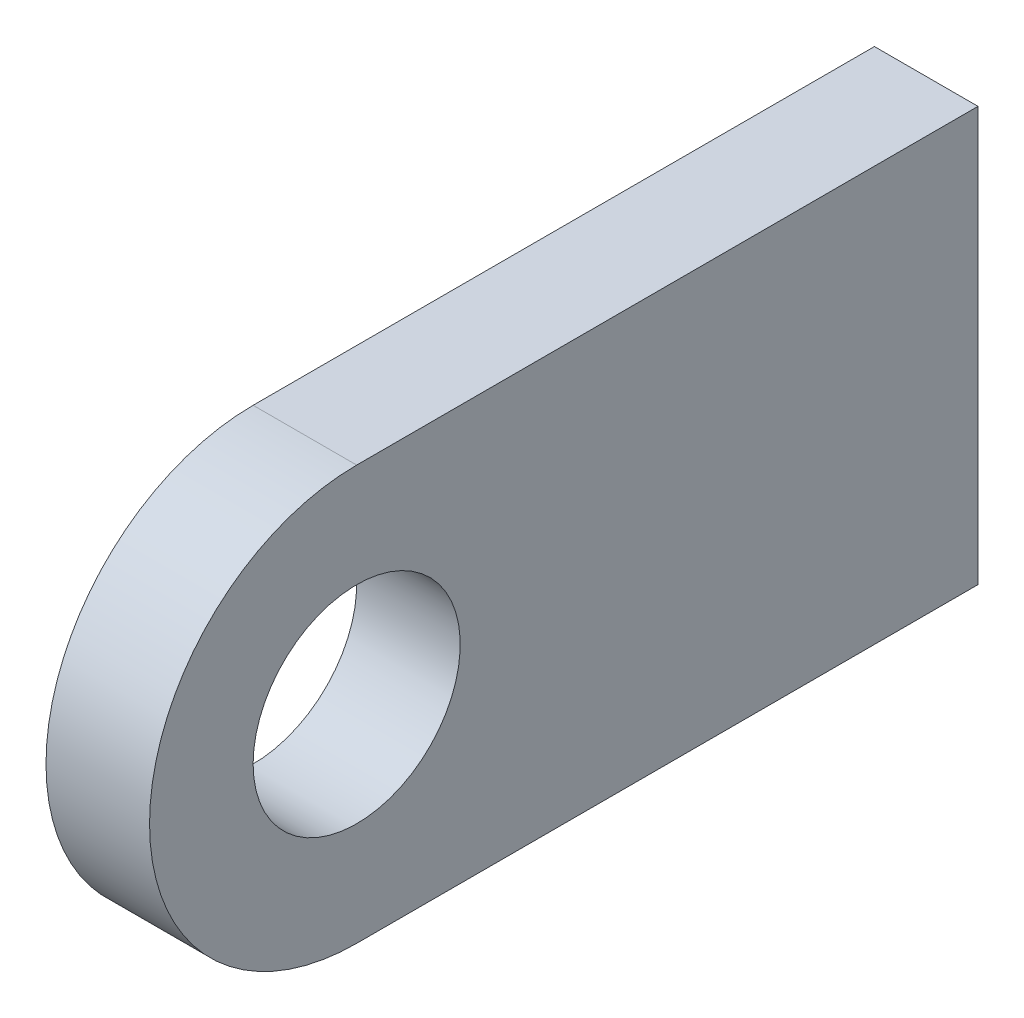
ISO-10303-21;
HEADER;
FILE_DESCRIPTION(('STEP AP214'),'2;1');
FILE_NAME('part.step','',(''),(''),'','','');
FILE_SCHEMA(('AUTOMOTIVE_DESIGN { 1 0 10303 214 1 1 1 1 }'));
ENDSEC;
DATA;
#1=APPLICATION_CONTEXT('core data for automotive mechanical design processes');
#2=APPLICATION_PROTOCOL_DEFINITION('international standard','automotive_design',2000,#1);
#3=PRODUCT_CONTEXT('',#1,'mechanical');
#4=PRODUCT('Part','Part','',(#3));
#5=PRODUCT_RELATED_PRODUCT_CATEGORY('part','',(#4));
#6=PRODUCT_DEFINITION_FORMATION('','',#4);
#7=PRODUCT_DEFINITION_CONTEXT('part definition',#1,'design');
#8=PRODUCT_DEFINITION('design','',#6,#7);
#9=PRODUCT_DEFINITION_SHAPE('','',#8);
#10=(LENGTH_UNIT() NAMED_UNIT(*) SI_UNIT(.MILLI.,.METRE.));
#11=(NAMED_UNIT(*) PLANE_ANGLE_UNIT() SI_UNIT($,.RADIAN.));
#12=(NAMED_UNIT(*) SI_UNIT($,.STERADIAN.) SOLID_ANGLE_UNIT());
#13=UNCERTAINTY_MEASURE_WITH_UNIT(LENGTH_MEASURE(1.E-05),#10,'distance_accuracy_value','');
#14=(GEOMETRIC_REPRESENTATION_CONTEXT(3) GLOBAL_UNCERTAINTY_ASSIGNED_CONTEXT((#13)) GLOBAL_UNIT_ASSIGNED_CONTEXT((#10,
#11,#12)) REPRESENTATION_CONTEXT('',''));
#15=CARTESIAN_POINT('',(0.,0.,0.));
#16=DIRECTION('',(0.,0.,1.));
#17=DIRECTION('',(1.,0.,0.));
#18=AXIS2_PLACEMENT_3D('',#15,#16,#17);
#19=CARTESIAN_POINT('',(-13.,-200.,150.));
#20=DIRECTION('',(-1.,0.,0.));
#21=DIRECTION('',(0.,0.,1.));
#22=AXIS2_PLACEMENT_3D('',#19,#20,#21);
#23=PLANE('',#22);
#24=CARTESIAN_POINT('',(-13.,-200.,150.));
#25=DIRECTION('',(-1.,0.,0.));
#26=DIRECTION('',(0.,0.,1.));
#27=AXIS2_PLACEMENT_3D('',#24,#25,#26);
#28=CIRCLE('',#27,10.);
#29=CARTESIAN_POINT('',(-13.,-210.,150.));
#30=VERTEX_POINT('',#29);
#31=CARTESIAN_POINT('',(-13.,-190.,150.));
#32=VERTEX_POINT('',#31);
#33=EDGE_CURVE('E111',#30,#32,#28,.T.);
#34=ORIENTED_EDGE('',*,*,#33,.T.);
#35=DIRECTION('',(0.,0.,-1.));
#36=VECTOR('',#35,1.);
#37=CARTESIAN_POINT('',(-13.,-190.,150.));
#38=LINE('',#37,#36);
#39=CARTESIAN_POINT('',(-13.,-190.,120.));
#40=VERTEX_POINT('',#39);
#41=EDGE_CURVE('E109',#32,#40,#38,.T.);
#42=ORIENTED_EDGE('',*,*,#41,.T.);
#43=DIRECTION('',(0.,-1.,0.));
#44=VECTOR('',#43,1.);
#45=CARTESIAN_POINT('',(-13.,-190.,120.));
#46=LINE('',#45,#44);
#47=CARTESIAN_POINT('',(-13.,-210.,120.));
#48=VERTEX_POINT('',#47);
#49=EDGE_CURVE('E107',#40,#48,#46,.T.);
#50=ORIENTED_EDGE('',*,*,#49,.T.);
#51=DIRECTION('',(0.,0.,1.));
#52=VECTOR('',#51,1.);
#53=CARTESIAN_POINT('',(-13.,-210.,120.));
#54=LINE('',#53,#52);
#55=EDGE_CURVE('E66',#48,#30,#54,.T.);
#56=ORIENTED_EDGE('',*,*,#55,.T.);
#57=EDGE_LOOP('',(#34,#42,#50,#56));
#58=FACE_BOUND('',#57,.T.);
#59=CARTESIAN_POINT('',(-13.,-200.,150.));
#60=DIRECTION('',(-1.,0.,0.));
#61=DIRECTION('',(0.,0.,1.));
#62=AXIS2_PLACEMENT_3D('',#59,#60,#61);
#63=CIRCLE('',#62,4.99999999999999);
#64=CARTESIAN_POINT('',(-13.,-200.,155.));
#65=VERTEX_POINT('',#64);
#66=EDGE_CURVE('E113',#65,#65,#63,.T.);
#67=ORIENTED_EDGE('',*,*,#66,.F.);
#68=EDGE_LOOP('',(#67));
#69=FACE_BOUND('',#68,.T.);
#70=ADVANCED_FACE('F42',(#58,#69),#23,.T.);
#71=CARTESIAN_POINT('',(-13.,-200.,150.));
#72=DIRECTION('',(1.,0.,0.));
#73=DIRECTION('',(0.,0.,-1.));
#74=AXIS2_PLACEMENT_3D('',#71,#72,#73);
#75=CYLINDRICAL_SURFACE('',#74,10.);
#76=CARTESIAN_POINT('',(-8.,-200.,150.));
#77=DIRECTION('',(-1.,0.,0.));
#78=DIRECTION('',(0.,0.,1.));
#79=AXIS2_PLACEMENT_3D('',#76,#77,#78);
#80=CIRCLE('',#79,10.);
#81=CARTESIAN_POINT('',(-8.,-210.,150.));
#82=VERTEX_POINT('',#81);
#83=CARTESIAN_POINT('',(-8.,-190.,150.));
#84=VERTEX_POINT('',#83);
#85=EDGE_CURVE('E58',#82,#84,#80,.T.);
#86=ORIENTED_EDGE('',*,*,#85,.T.);
#87=DIRECTION('',(1.,0.,0.));
#88=VECTOR('',#87,1.);
#89=CARTESIAN_POINT('',(-13.,-190.,150.));
#90=LINE('',#89,#88);
#91=EDGE_CURVE('E11',#32,#84,#90,.T.);
#92=ORIENTED_EDGE('',*,*,#91,.F.);
#93=ORIENTED_EDGE('',*,*,#33,.F.);
#94=DIRECTION('',(1.,0.,0.));
#95=VECTOR('',#94,1.);
#96=CARTESIAN_POINT('',(-13.,-210.,150.));
#97=LINE('',#96,#95);
#98=EDGE_CURVE('E101',#30,#82,#97,.T.);
#99=ORIENTED_EDGE('',*,*,#98,.T.);
#100=EDGE_LOOP('',(#86,#92,#93,#99));
#101=FACE_BOUND('',#100,.T.);
#102=ADVANCED_FACE('F44',(#101),#75,.T.);
#103=CARTESIAN_POINT('',(-13.,-190.,150.));
#104=DIRECTION('',(0.,-1.,0.));
#105=DIRECTION('',(0.,0.,-1.));
#106=AXIS2_PLACEMENT_3D('',#103,#104,#105);
#107=PLANE('',#106);
#108=ORIENTED_EDGE('',*,*,#91,.T.);
#109=DIRECTION('',(0.,0.,-1.));
#110=VECTOR('',#109,1.);
#111=CARTESIAN_POINT('',(-8.,-190.,160.));
#112=LINE('',#111,#110);
#113=CARTESIAN_POINT('',(-8.,-190.,120.));
#114=VERTEX_POINT('',#113);
#115=EDGE_CURVE('E90',#84,#114,#112,.T.);
#116=ORIENTED_EDGE('',*,*,#115,.T.);
#117=DIRECTION('',(1.,0.,0.));
#118=VECTOR('',#117,1.);
#119=CARTESIAN_POINT('',(-13.,-190.,120.));
#120=LINE('',#119,#118);
#121=EDGE_CURVE('E51',#40,#114,#120,.T.);
#122=ORIENTED_EDGE('',*,*,#121,.F.);
#123=ORIENTED_EDGE('',*,*,#41,.F.);
#124=EDGE_LOOP('',(#108,#116,#122,#123));
#125=FACE_BOUND('',#124,.T.);
#126=ADVANCED_FACE('F135',(#125),#107,.F.);
#127=CARTESIAN_POINT('',(-13.,-190.,120.));
#128=DIRECTION('',(0.,0.,1.));
#129=DIRECTION('',(1.,0.,0.));
#130=AXIS2_PLACEMENT_3D('',#127,#128,#129);
#131=PLANE('',#130);
#132=ORIENTED_EDGE('',*,*,#121,.T.);
#133=DIRECTION('',(0.,1.,0.));
#134=VECTOR('',#133,1.);
#135=CARTESIAN_POINT('',(-8.,-190.,120.));
#136=LINE('',#135,#134);
#137=CARTESIAN_POINT('',(-8.,-210.,120.));
#138=VERTEX_POINT('',#137);
#139=EDGE_CURVE('E85',#138,#114,#136,.T.);
#140=ORIENTED_EDGE('',*,*,#139,.F.);
#141=DIRECTION('',(1.,0.,0.));
#142=VECTOR('',#141,1.);
#143=CARTESIAN_POINT('',(-13.,-210.,120.));
#144=LINE('',#143,#142);
#145=EDGE_CURVE('E97',#48,#138,#144,.T.);
#146=ORIENTED_EDGE('',*,*,#145,.F.);
#147=ORIENTED_EDGE('',*,*,#49,.F.);
#148=EDGE_LOOP('',(#132,#140,#146,#147));
#149=FACE_BOUND('',#148,.T.);
#150=ADVANCED_FACE('F95',(#149),#131,.F.);
#151=CARTESIAN_POINT('',(-13.,-210.,120.));
#152=DIRECTION('',(0.,1.,0.));
#153=DIRECTION('',(0.,0.,1.));
#154=AXIS2_PLACEMENT_3D('',#151,#152,#153);
#155=PLANE('',#154);
#156=ORIENTED_EDGE('',*,*,#145,.T.);
#157=DIRECTION('',(0.,0.,-1.));
#158=VECTOR('',#157,1.);
#159=CARTESIAN_POINT('',(-8.,-210.,160.));
#160=LINE('',#159,#158);
#161=EDGE_CURVE('E82',#82,#138,#160,.T.);
#162=ORIENTED_EDGE('',*,*,#161,.F.);
#163=ORIENTED_EDGE('',*,*,#98,.F.);
#164=ORIENTED_EDGE('',*,*,#55,.F.);
#165=EDGE_LOOP('',(#156,#162,#163,#164));
#166=FACE_BOUND('',#165,.T.);
#167=ADVANCED_FACE('F100',(#166),#155,.F.);
#168=CARTESIAN_POINT('',(-13.,-200.,150.));
#169=DIRECTION('',(1.,0.,0.));
#170=DIRECTION('',(0.,0.,-1.));
#171=AXIS2_PLACEMENT_3D('',#168,#169,#170);
#172=CYLINDRICAL_SURFACE('',#171,4.99999999999999);
#173=CARTESIAN_POINT('',(-8.,-200.,150.));
#174=DIRECTION('',(-1.,0.,0.));
#175=DIRECTION('',(0.,0.,1.));
#176=AXIS2_PLACEMENT_3D('',#173,#174,#175);
#177=CIRCLE('',#176,4.99999999999999);
#178=CARTESIAN_POINT('',(-8.,-200.,155.));
#179=VERTEX_POINT('',#178);
#180=EDGE_CURVE('E46',#179,#179,#177,.T.);
#181=ORIENTED_EDGE('',*,*,#180,.F.);
#182=EDGE_LOOP('',(#181));
#183=FACE_BOUND('',#182,.T.);
#184=ORIENTED_EDGE('',*,*,#66,.T.);
#185=EDGE_LOOP('',(#184));
#186=FACE_BOUND('',#185,.T.);
#187=ADVANCED_FACE('F122',(#183,#186),#172,.F.);
#188=CARTESIAN_POINT('',(-8.,-190.,160.));
#189=DIRECTION('',(-1.,0.,0.));
#190=DIRECTION('',(0.,0.,1.));
#191=AXIS2_PLACEMENT_3D('',#188,#189,#190);
#192=PLANE('',#191);
#193=ORIENTED_EDGE('',*,*,#180,.T.);
#194=EDGE_LOOP('',(#193));
#195=FACE_BOUND('',#194,.T.);
#196=ORIENTED_EDGE('',*,*,#85,.F.);
#197=ORIENTED_EDGE('',*,*,#161,.T.);
#198=ORIENTED_EDGE('',*,*,#139,.T.);
#199=ORIENTED_EDGE('',*,*,#115,.F.);
#200=EDGE_LOOP('',(#196,#197,#198,#199));
#201=FACE_BOUND('',#200,.T.);
#202=ADVANCED_FACE('F84',(#195,#201),#192,.F.);
#203=CLOSED_SHELL('',(#70,#102,#126,#150,#167,#187,#202));
#204=MANIFOLD_SOLID_BREP('B2',#203);
#205=ADVANCED_BREP_SHAPE_REPRESENTATION('',(#18,#204),#14);
#206=SHAPE_DEFINITION_REPRESENTATION(#9,#205);
ENDSEC;
END-ISO-10303-21;
